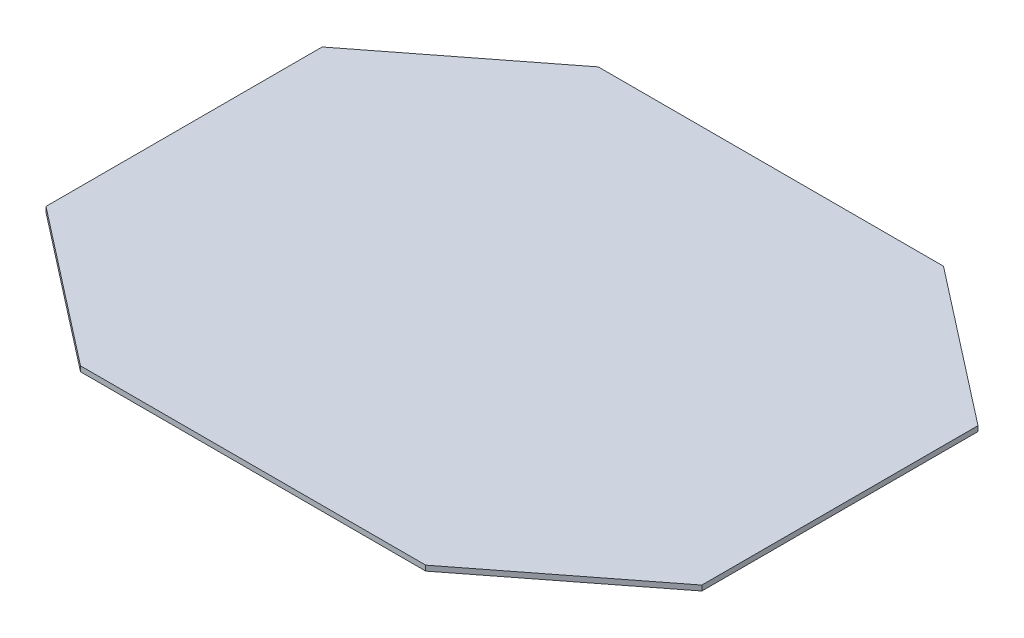
ISO-10303-21;
HEADER;
FILE_DESCRIPTION(('STEP AP214'),'2;1');
FILE_NAME('part.step','',(''),(''),'','','');
FILE_SCHEMA(('AUTOMOTIVE_DESIGN { 1 0 10303 214 1 1 1 1 }'));
ENDSEC;
DATA;
#1=APPLICATION_CONTEXT('core data for automotive mechanical design processes');
#2=APPLICATION_PROTOCOL_DEFINITION('international standard','automotive_design',2000,#1);
#3=PRODUCT_CONTEXT('',#1,'mechanical');
#4=PRODUCT('Part','Part','',(#3));
#5=PRODUCT_RELATED_PRODUCT_CATEGORY('part','',(#4));
#6=PRODUCT_DEFINITION_FORMATION('','',#4);
#7=PRODUCT_DEFINITION_CONTEXT('part definition',#1,'design');
#8=PRODUCT_DEFINITION('design','',#6,#7);
#9=PRODUCT_DEFINITION_SHAPE('','',#8);
#10=(LENGTH_UNIT() NAMED_UNIT(*) SI_UNIT(.MILLI.,.METRE.));
#11=(NAMED_UNIT(*) PLANE_ANGLE_UNIT() SI_UNIT($,.RADIAN.));
#12=(NAMED_UNIT(*) SI_UNIT($,.STERADIAN.) SOLID_ANGLE_UNIT());
#13=UNCERTAINTY_MEASURE_WITH_UNIT(LENGTH_MEASURE(1.E-05),#10,'distance_accuracy_value','');
#14=(GEOMETRIC_REPRESENTATION_CONTEXT(3) GLOBAL_UNCERTAINTY_ASSIGNED_CONTEXT((#13)) GLOBAL_UNIT_ASSIGNED_CONTEXT((#10,
#11,#12)) REPRESENTATION_CONTEXT('',''));
#15=CARTESIAN_POINT('',(0.,0.,0.));
#16=DIRECTION('',(0.,0.,1.));
#17=DIRECTION('',(1.,0.,0.));
#18=AXIS2_PLACEMENT_3D('',#15,#16,#17);
#19=CARTESIAN_POINT('',(-190.,3.,-80.));
#20=DIRECTION('',(0.61394061351492,0.,0.789352217376326));
#21=DIRECTION('',(0.789352217376326,0.,-0.613940613514921));
#22=AXIS2_PLACEMENT_3D('',#19,#20,#21);
#23=PLANE('',#22);
#24=DIRECTION('',(-0.789352217376326,0.,0.613940613514921));
#25=VECTOR('',#24,1.);
#26=CARTESIAN_POINT('',(-190.,0.,-80.));
#27=LINE('',#26,#25);
#28=CARTESIAN_POINT('',(-100.,0.,-150.));
#29=VERTEX_POINT('',#28);
#30=CARTESIAN_POINT('',(-190.,0.,-80.));
#31=VERTEX_POINT('',#30);
#32=EDGE_CURVE('E128',#29,#31,#27,.T.);
#33=ORIENTED_EDGE('',*,*,#32,.T.);
#34=DIRECTION('',(0.,-1.,0.));
#35=VECTOR('',#34,1.);
#36=CARTESIAN_POINT('',(-190.,3.,-80.));
#37=LINE('',#36,#35);
#38=CARTESIAN_POINT('',(-190.,3.,-80.));
#39=VERTEX_POINT('',#38);
#40=EDGE_CURVE('E11',#39,#31,#37,.T.);
#41=ORIENTED_EDGE('',*,*,#40,.F.);
#42=DIRECTION('',(-0.789352217376326,0.,0.613940613514921));
#43=VECTOR('',#42,1.);
#44=CARTESIAN_POINT('',(-190.,3.,-80.));
#45=LINE('',#44,#43);
#46=CARTESIAN_POINT('',(-100.,3.,-150.));
#47=VERTEX_POINT('',#46);
#48=EDGE_CURVE('E143',#47,#39,#45,.T.);
#49=ORIENTED_EDGE('',*,*,#48,.F.);
#50=DIRECTION('',(0.,-1.,0.));
#51=VECTOR('',#50,1.);
#52=CARTESIAN_POINT('',(-100.,3.,-150.));
#53=LINE('',#52,#51);
#54=EDGE_CURVE('E124',#47,#29,#53,.T.);
#55=ORIENTED_EDGE('',*,*,#54,.T.);
#56=EDGE_LOOP('',(#33,#41,#49,#55));
#57=FACE_BOUND('',#56,.T.);
#58=ADVANCED_FACE('F33',(#57),#23,.F.);
#59=CARTESIAN_POINT('',(-190.,3.,80.));
#60=DIRECTION('',(1.,0.,0.));
#61=DIRECTION('',(0.,0.,-1.));
#62=AXIS2_PLACEMENT_3D('',#59,#60,#61);
#63=PLANE('',#62);
#64=DIRECTION('',(0.,0.,1.));
#65=VECTOR('',#64,1.);
#66=CARTESIAN_POINT('',(-190.,0.,80.));
#67=LINE('',#66,#65);
#68=CARTESIAN_POINT('',(-190.,0.,80.));
#69=VERTEX_POINT('',#68);
#70=EDGE_CURVE('E131',#31,#69,#67,.T.);
#71=ORIENTED_EDGE('',*,*,#70,.T.);
#72=DIRECTION('',(0.,-1.,0.));
#73=VECTOR('',#72,1.);
#74=CARTESIAN_POINT('',(-190.,3.,80.));
#75=LINE('',#74,#73);
#76=CARTESIAN_POINT('',(-190.,3.,80.));
#77=VERTEX_POINT('',#76);
#78=EDGE_CURVE('E41',#77,#69,#75,.T.);
#79=ORIENTED_EDGE('',*,*,#78,.F.);
#80=DIRECTION('',(0.,0.,1.));
#81=VECTOR('',#80,1.);
#82=CARTESIAN_POINT('',(-190.,3.,-60.));
#83=LINE('',#82,#81);
#84=EDGE_CURVE('E92',#39,#77,#83,.T.);
#85=ORIENTED_EDGE('',*,*,#84,.F.);
#86=ORIENTED_EDGE('',*,*,#40,.T.);
#87=EDGE_LOOP('',(#71,#79,#85,#86));
#88=FACE_BOUND('',#87,.T.);
#89=ADVANCED_FACE('F178',(#88),#63,.F.);
#90=CARTESIAN_POINT('',(-99.9999999999999,3.,150.));
#91=DIRECTION('',(0.61394061351492,0.,-0.789352217376326));
#92=DIRECTION('',(-0.789352217376326,0.,-0.613940613514921));
#93=AXIS2_PLACEMENT_3D('',#90,#91,#92);
#94=PLANE('',#93);
#95=DIRECTION('',(0.789352217376326,0.,0.613940613514921));
#96=VECTOR('',#95,1.);
#97=CARTESIAN_POINT('',(-99.9999999999999,0.,150.));
#98=LINE('',#97,#96);
#99=CARTESIAN_POINT('',(-99.9999999999999,0.,150.));
#100=VERTEX_POINT('',#99);
#101=EDGE_CURVE('E133',#69,#100,#98,.T.);
#102=ORIENTED_EDGE('',*,*,#101,.T.);
#103=DIRECTION('',(0.,-1.,0.));
#104=VECTOR('',#103,1.);
#105=CARTESIAN_POINT('',(-99.9999999999999,3.,150.));
#106=LINE('',#105,#104);
#107=CARTESIAN_POINT('',(-99.9999999999999,3.,150.));
#108=VERTEX_POINT('',#107);
#109=EDGE_CURVE('E150',#108,#100,#106,.T.);
#110=ORIENTED_EDGE('',*,*,#109,.F.);
#111=DIRECTION('',(0.789352217376326,0.,0.613940613514921));
#112=VECTOR('',#111,1.);
#113=CARTESIAN_POINT('',(-99.9999999999999,3.,150.));
#114=LINE('',#113,#112);
#115=EDGE_CURVE('E158',#77,#108,#114,.T.);
#116=ORIENTED_EDGE('',*,*,#115,.F.);
#117=ORIENTED_EDGE('',*,*,#78,.T.);
#118=EDGE_LOOP('',(#102,#110,#116,#117));
#119=FACE_BOUND('',#118,.T.);
#120=ADVANCED_FACE('F156',(#119),#94,.F.);
#121=CARTESIAN_POINT('',(100.,3.,150.));
#122=DIRECTION('',(0.,0.,-1.));
#123=DIRECTION('',(-1.,0.,0.));
#124=AXIS2_PLACEMENT_3D('',#121,#122,#123);
#125=PLANE('',#124);
#126=DIRECTION('',(1.,0.,0.));
#127=VECTOR('',#126,1.);
#128=CARTESIAN_POINT('',(100.,0.,150.));
#129=LINE('',#128,#127);
#130=CARTESIAN_POINT('',(100.,0.,150.));
#131=VERTEX_POINT('',#130);
#132=EDGE_CURVE('E135',#100,#131,#129,.T.);
#133=ORIENTED_EDGE('',*,*,#132,.T.);
#134=DIRECTION('',(0.,-1.,0.));
#135=VECTOR('',#134,1.);
#136=CARTESIAN_POINT('',(100.,3.,150.));
#137=LINE('',#136,#135);
#138=CARTESIAN_POINT('',(100.,3.,150.));
#139=VERTEX_POINT('',#138);
#140=EDGE_CURVE('E147',#139,#131,#137,.T.);
#141=ORIENTED_EDGE('',*,*,#140,.F.);
#142=DIRECTION('',(1.,0.,0.));
#143=VECTOR('',#142,1.);
#144=CARTESIAN_POINT('',(100.,3.,150.));
#145=LINE('',#144,#143);
#146=EDGE_CURVE('E170',#108,#139,#145,.T.);
#147=ORIENTED_EDGE('',*,*,#146,.F.);
#148=ORIENTED_EDGE('',*,*,#109,.T.);
#149=EDGE_LOOP('',(#133,#141,#147,#148));
#150=FACE_BOUND('',#149,.T.);
#151=ADVANCED_FACE('F166',(#150),#125,.F.);
#152=CARTESIAN_POINT('',(190.,3.,80.));
#153=DIRECTION('',(-0.61394061351492,0.,-0.789352217376326));
#154=DIRECTION('',(-0.789352217376326,0.,0.61394061351492));
#155=AXIS2_PLACEMENT_3D('',#152,#153,#154);
#156=PLANE('',#155);
#157=DIRECTION('',(0.789352217376326,0.,-0.61394061351492));
#158=VECTOR('',#157,1.);
#159=CARTESIAN_POINT('',(190.,0.,80.));
#160=LINE('',#159,#158);
#161=CARTESIAN_POINT('',(190.,0.,80.));
#162=VERTEX_POINT('',#161);
#163=EDGE_CURVE('E137',#131,#162,#160,.T.);
#164=ORIENTED_EDGE('',*,*,#163,.T.);
#165=DIRECTION('',(0.,-1.,0.));
#166=VECTOR('',#165,1.);
#167=CARTESIAN_POINT('',(190.,3.,80.));
#168=LINE('',#167,#166);
#169=CARTESIAN_POINT('',(190.,3.,80.));
#170=VERTEX_POINT('',#169);
#171=EDGE_CURVE('E119',#170,#162,#168,.T.);
#172=ORIENTED_EDGE('',*,*,#171,.F.);
#173=DIRECTION('',(0.789352217376326,0.,-0.61394061351492));
#174=VECTOR('',#173,1.);
#175=CARTESIAN_POINT('',(190.,3.,80.));
#176=LINE('',#175,#174);
#177=EDGE_CURVE('E111',#139,#170,#176,.T.);
#178=ORIENTED_EDGE('',*,*,#177,.F.);
#179=ORIENTED_EDGE('',*,*,#140,.T.);
#180=EDGE_LOOP('',(#164,#172,#178,#179));
#181=FACE_BOUND('',#180,.T.);
#182=ADVANCED_FACE('F169',(#181),#156,.F.);
#183=CARTESIAN_POINT('',(190.,3.,-80.));
#184=DIRECTION('',(-1.,0.,0.));
#185=DIRECTION('',(0.,0.,1.));
#186=AXIS2_PLACEMENT_3D('',#183,#184,#185);
#187=PLANE('',#186);
#188=DIRECTION('',(0.,0.,-1.));
#189=VECTOR('',#188,1.);
#190=CARTESIAN_POINT('',(190.,0.,-80.));
#191=LINE('',#190,#189);
#192=CARTESIAN_POINT('',(190.,0.,-80.));
#193=VERTEX_POINT('',#192);
#194=EDGE_CURVE('E118',#162,#193,#191,.T.);
#195=ORIENTED_EDGE('',*,*,#194,.T.);
#196=DIRECTION('',(0.,-1.,0.));
#197=VECTOR('',#196,1.);
#198=CARTESIAN_POINT('',(190.,3.,-80.));
#199=LINE('',#198,#197);
#200=CARTESIAN_POINT('',(190.,3.,-80.));
#201=VERTEX_POINT('',#200);
#202=EDGE_CURVE('E116',#201,#193,#199,.T.);
#203=ORIENTED_EDGE('',*,*,#202,.F.);
#204=DIRECTION('',(0.,0.,-1.));
#205=VECTOR('',#204,1.);
#206=CARTESIAN_POINT('',(190.,3.,60.));
#207=LINE('',#206,#205);
#208=EDGE_CURVE('E105',#170,#201,#207,.T.);
#209=ORIENTED_EDGE('',*,*,#208,.F.);
#210=ORIENTED_EDGE('',*,*,#171,.T.);
#211=EDGE_LOOP('',(#195,#203,#209,#210));
#212=FACE_BOUND('',#211,.T.);
#213=ADVANCED_FACE('F117',(#212),#187,.F.);
#214=CARTESIAN_POINT('',(100.,3.,-150.));
#215=DIRECTION('',(-0.61394061351492,0.,0.789352217376327));
#216=DIRECTION('',(0.789352217376327,0.,0.61394061351492));
#217=AXIS2_PLACEMENT_3D('',#214,#215,#216);
#218=PLANE('',#217);
#219=DIRECTION('',(-0.789352217376327,0.,-0.61394061351492));
#220=VECTOR('',#219,1.);
#221=CARTESIAN_POINT('',(100.,0.,-150.));
#222=LINE('',#221,#220);
#223=CARTESIAN_POINT('',(100.,0.,-150.));
#224=VERTEX_POINT('',#223);
#225=EDGE_CURVE('E78',#193,#224,#222,.T.);
#226=ORIENTED_EDGE('',*,*,#225,.T.);
#227=DIRECTION('',(0.,-1.,0.));
#228=VECTOR('',#227,1.);
#229=CARTESIAN_POINT('',(100.,3.,-150.));
#230=LINE('',#229,#228);
#231=CARTESIAN_POINT('',(100.,3.,-150.));
#232=VERTEX_POINT('',#231);
#233=EDGE_CURVE('E120',#232,#224,#230,.T.);
#234=ORIENTED_EDGE('',*,*,#233,.F.);
#235=DIRECTION('',(-0.789352217376327,0.,-0.61394061351492));
#236=VECTOR('',#235,1.);
#237=CARTESIAN_POINT('',(100.,3.,-150.));
#238=LINE('',#237,#236);
#239=EDGE_CURVE('E109',#201,#232,#238,.T.);
#240=ORIENTED_EDGE('',*,*,#239,.F.);
#241=ORIENTED_EDGE('',*,*,#202,.T.);
#242=EDGE_LOOP('',(#226,#234,#240,#241));
#243=FACE_BOUND('',#242,.T.);
#244=ADVANCED_FACE('F122',(#243),#218,.F.);
#245=CARTESIAN_POINT('',(-100.,3.,-150.));
#246=DIRECTION('',(0.,0.,1.));
#247=DIRECTION('',(1.,0.,0.));
#248=AXIS2_PLACEMENT_3D('',#245,#246,#247);
#249=PLANE('',#248);
#250=DIRECTION('',(-1.,0.,0.));
#251=VECTOR('',#250,1.);
#252=CARTESIAN_POINT('',(-100.,0.,-150.));
#253=LINE('',#252,#251);
#254=EDGE_CURVE('E84',#224,#29,#253,.T.);
#255=ORIENTED_EDGE('',*,*,#254,.T.);
#256=ORIENTED_EDGE('',*,*,#54,.F.);
#257=DIRECTION('',(-1.,0.,0.));
#258=VECTOR('',#257,1.);
#259=CARTESIAN_POINT('',(-100.,3.,-150.));
#260=LINE('',#259,#258);
#261=EDGE_CURVE('E49',#232,#47,#260,.T.);
#262=ORIENTED_EDGE('',*,*,#261,.F.);
#263=ORIENTED_EDGE('',*,*,#233,.T.);
#264=EDGE_LOOP('',(#255,#256,#262,#263));
#265=FACE_BOUND('',#264,.T.);
#266=ADVANCED_FACE('F194',(#265),#249,.F.);
#267=CARTESIAN_POINT('',(0.,3.,0.));
#268=DIRECTION('',(0.,-1.,0.));
#269=DIRECTION('',(0.,0.,-1.));
#270=AXIS2_PLACEMENT_3D('',#267,#268,#269);
#271=PLANE('',#270);
#272=ORIENTED_EDGE('',*,*,#48,.T.);
#273=ORIENTED_EDGE('',*,*,#84,.T.);
#274=ORIENTED_EDGE('',*,*,#115,.T.);
#275=ORIENTED_EDGE('',*,*,#146,.T.);
#276=ORIENTED_EDGE('',*,*,#177,.T.);
#277=ORIENTED_EDGE('',*,*,#208,.T.);
#278=ORIENTED_EDGE('',*,*,#239,.T.);
#279=ORIENTED_EDGE('',*,*,#261,.T.);
#280=EDGE_LOOP('',(#272,#273,#274,#275,#276,#277,#278,#279));
#281=FACE_BOUND('',#280,.T.);
#282=ADVANCED_FACE('F107',(#281),#271,.F.);
#283=CARTESIAN_POINT('',(0.,0.,0.));
#284=DIRECTION('',(0.,-1.,0.));
#285=DIRECTION('',(0.,0.,-1.));
#286=AXIS2_PLACEMENT_3D('',#283,#284,#285);
#287=PLANE('',#286);
#288=ORIENTED_EDGE('',*,*,#32,.F.);
#289=ORIENTED_EDGE('',*,*,#254,.F.);
#290=ORIENTED_EDGE('',*,*,#225,.F.);
#291=ORIENTED_EDGE('',*,*,#194,.F.);
#292=ORIENTED_EDGE('',*,*,#163,.F.);
#293=ORIENTED_EDGE('',*,*,#132,.F.);
#294=ORIENTED_EDGE('',*,*,#101,.F.);
#295=ORIENTED_EDGE('',*,*,#70,.F.);
#296=EDGE_LOOP('',(#288,#289,#290,#291,#292,#293,#294,#295));
#297=FACE_BOUND('',#296,.T.);
#298=ADVANCED_FACE('F162',(#297),#287,.T.);
#299=CLOSED_SHELL('',(#58,#89,#120,#151,#182,#213,#244,#266,#282,#298));
#300=MANIFOLD_SOLID_BREP('B2',#299);
#301=ADVANCED_BREP_SHAPE_REPRESENTATION('',(#18,#300),#14);
#302=SHAPE_DEFINITION_REPRESENTATION(#9,#301);
ENDSEC;
END-ISO-10303-21;
